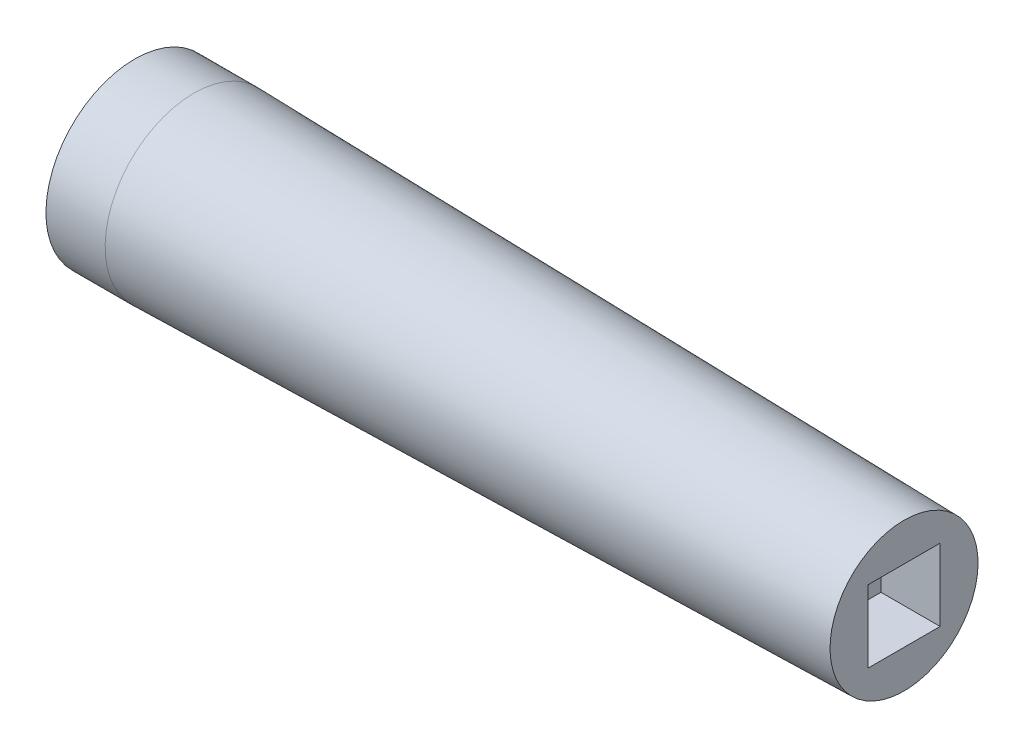
ISO-10303-21;
HEADER;
FILE_DESCRIPTION(('STEP AP214'),'2;1');
FILE_NAME('part.step','',(''),(''),'','','');
FILE_SCHEMA(('AUTOMOTIVE_DESIGN { 1 0 10303 214 1 1 1 1 }'));
ENDSEC;
DATA;
#1=APPLICATION_CONTEXT('core data for automotive mechanical design processes');
#2=APPLICATION_PROTOCOL_DEFINITION('international standard','automotive_design',2000,#1);
#3=PRODUCT_CONTEXT('',#1,'mechanical');
#4=PRODUCT('Part','Part','',(#3));
#5=PRODUCT_RELATED_PRODUCT_CATEGORY('part','',(#4));
#6=PRODUCT_DEFINITION_FORMATION('','',#4);
#7=PRODUCT_DEFINITION_CONTEXT('part definition',#1,'design');
#8=PRODUCT_DEFINITION('design','',#6,#7);
#9=PRODUCT_DEFINITION_SHAPE('','',#8);
#10=(LENGTH_UNIT() NAMED_UNIT(*) SI_UNIT(.MILLI.,.METRE.));
#11=(NAMED_UNIT(*) PLANE_ANGLE_UNIT() SI_UNIT($,.RADIAN.));
#12=(NAMED_UNIT(*) SI_UNIT($,.STERADIAN.) SOLID_ANGLE_UNIT());
#13=UNCERTAINTY_MEASURE_WITH_UNIT(LENGTH_MEASURE(1.E-05),#10,'distance_accuracy_value','');
#14=(GEOMETRIC_REPRESENTATION_CONTEXT(3) GLOBAL_UNCERTAINTY_ASSIGNED_CONTEXT((#13)) GLOBAL_UNIT_ASSIGNED_CONTEXT((#10,
#11,#12)) REPRESENTATION_CONTEXT('',''));
#15=CARTESIAN_POINT('',(0.,0.,0.));
#16=DIRECTION('',(0.,0.,1.));
#17=DIRECTION('',(1.,0.,0.));
#18=AXIS2_PLACEMENT_3D('',#15,#16,#17);
#19=CARTESIAN_POINT('',(82.55,0.,0.));
#20=DIRECTION('',(1.,0.,0.));
#21=DIRECTION('',(0.,1.,0.));
#22=AXIS2_PLACEMENT_3D('',#19,#20,#21);
#23=PLANE('',#22);
#24=DIRECTION('',(0.,1.,0.));
#25=VECTOR('',#24,1.);
#26=CARTESIAN_POINT('',(82.55,-7.74499999999998,-7.745));
#27=LINE('',#26,#25);
#28=CARTESIAN_POINT('',(82.55,-7.74499999999998,-7.745));
#29=VERTEX_POINT('',#28);
#30=CARTESIAN_POINT('',(82.55,7.74500000000003,-7.745));
#31=VERTEX_POINT('',#30);
#32=EDGE_CURVE('E51',#29,#31,#27,.T.);
#33=ORIENTED_EDGE('',*,*,#32,.F.);
#34=DIRECTION('',(0.,0.,-1.));
#35=VECTOR('',#34,1.);
#36=CARTESIAN_POINT('',(82.55,-7.74499999999998,7.745));
#37=LINE('',#36,#35);
#38=CARTESIAN_POINT('',(82.55,-7.74499999999998,7.745));
#39=VERTEX_POINT('',#38);
#40=EDGE_CURVE('E102',#39,#29,#37,.T.);
#41=ORIENTED_EDGE('',*,*,#40,.F.);
#42=DIRECTION('',(0.,-1.,0.));
#43=VECTOR('',#42,1.);
#44=CARTESIAN_POINT('',(82.55,-7.74499999999998,7.745));
#45=LINE('',#44,#43);
#46=CARTESIAN_POINT('',(82.55,7.74500000000003,7.745));
#47=VERTEX_POINT('',#46);
#48=EDGE_CURVE('E108',#47,#39,#45,.T.);
#49=ORIENTED_EDGE('',*,*,#48,.F.);
#50=DIRECTION('',(0.,0.,1.));
#51=VECTOR('',#50,1.);
#52=CARTESIAN_POINT('',(82.55,7.74500000000003,7.745));
#53=LINE('',#52,#51);
#54=EDGE_CURVE('E86',#31,#47,#53,.T.);
#55=ORIENTED_EDGE('',*,*,#54,.F.);
#56=EDGE_LOOP('',(#33,#41,#49,#55));
#57=FACE_BOUND('',#56,.T.);
#58=CARTESIAN_POINT('',(82.55,0.,0.));
#59=DIRECTION('',(1.,0.,0.));
#60=DIRECTION('',(0.,1.,0.));
#61=AXIS2_PLACEMENT_3D('',#58,#59,#60);
#62=CIRCLE('',#61,15.88);
#63=CARTESIAN_POINT('',(82.55,15.88,0.));
#64=VERTEX_POINT('',#63);
#65=EDGE_CURVE('E112',#64,#64,#62,.T.);
#66=ORIENTED_EDGE('',*,*,#65,.T.);
#67=EDGE_LOOP('',(#66));
#68=FACE_BOUND('',#67,.T.);
#69=ADVANCED_FACE('F37',(#57,#68),#23,.T.);
#70=CARTESIAN_POINT('',(-82.55,0.,0.));
#71=DIRECTION('',(-1.,0.,0.));
#72=DIRECTION('',(0.,-1.,0.));
#73=AXIS2_PLACEMENT_3D('',#70,#71,#72);
#74=PLANE('',#73);
#75=CARTESIAN_POINT('',(-82.55,0.,0.));
#76=DIRECTION('',(1.,0.,0.));
#77=DIRECTION('',(0.,1.,0.));
#78=AXIS2_PLACEMENT_3D('',#75,#76,#77);
#79=CIRCLE('',#78,19.05);
#80=CARTESIAN_POINT('',(-82.55,19.05,0.));
#81=VERTEX_POINT('',#80);
#82=EDGE_CURVE('E11',#81,#81,#79,.T.);
#83=ORIENTED_EDGE('',*,*,#82,.F.);
#84=EDGE_LOOP('',(#83));
#85=FACE_BOUND('',#84,.T.);
#86=ADVANCED_FACE('F124',(#85),#74,.T.);
#87=CARTESIAN_POINT('',(82.55,0.,0.));
#88=DIRECTION('',(1.,0.,0.));
#89=DIRECTION('',(0.,1.,0.));
#90=AXIS2_PLACEMENT_3D('',#87,#88,#89);
#91=CYLINDRICAL_SURFACE('',#90,19.05);
#92=ORIENTED_EDGE('',*,*,#82,.T.);
#93=EDGE_LOOP('',(#92));
#94=FACE_BOUND('',#93,.T.);
#95=CARTESIAN_POINT('',(-69.85,0.,0.));
#96=DIRECTION('',(1.,0.,0.));
#97=DIRECTION('',(0.,1.,0.));
#98=AXIS2_PLACEMENT_3D('',#95,#96,#97);
#99=CIRCLE('',#98,19.05);
#100=CARTESIAN_POINT('',(-69.85,19.05,0.));
#101=VERTEX_POINT('',#100);
#102=EDGE_CURVE('E44',#101,#101,#99,.T.);
#103=ORIENTED_EDGE('',*,*,#102,.F.);
#104=EDGE_LOOP('',(#103));
#105=FACE_BOUND('',#104,.T.);
#106=ADVANCED_FACE('F122',(#94,#105),#91,.T.);
#107=CARTESIAN_POINT('',(82.55,0.,0.));
#108=DIRECTION('',(-1.,0.,0.));
#109=DIRECTION('',(0.,-1.,0.));
#110=AXIS2_PLACEMENT_3D('',#107,#108,#109);
#111=CONICAL_SURFACE('',#110,15.88,0.020797525848452);
#112=ORIENTED_EDGE('',*,*,#102,.T.);
#113=EDGE_LOOP('',(#112));
#114=FACE_BOUND('',#113,.T.);
#115=ORIENTED_EDGE('',*,*,#65,.F.);
#116=EDGE_LOOP('',(#115));
#117=FACE_BOUND('',#116,.T.);
#118=ADVANCED_FACE('F119',(#114,#117),#111,.T.);
#119=CARTESIAN_POINT('',(69.85,-7.74499999999998,-7.745));
#120=DIRECTION('',(0.,0.,-1.));
#121=DIRECTION('',(-1.,0.,0.));
#122=AXIS2_PLACEMENT_3D('',#119,#120,#121);
#123=PLANE('',#122);
#124=ORIENTED_EDGE('',*,*,#32,.T.);
#125=DIRECTION('',(1.,0.,0.));
#126=VECTOR('',#125,1.);
#127=CARTESIAN_POINT('',(69.85,7.74500000000002,-7.745));
#128=LINE('',#127,#126);
#129=CARTESIAN_POINT('',(69.85,7.74500000000002,-7.745));
#130=VERTEX_POINT('',#129);
#131=EDGE_CURVE('E74',#130,#31,#128,.T.);
#132=ORIENTED_EDGE('',*,*,#131,.F.);
#133=DIRECTION('',(0.,1.,0.));
#134=VECTOR('',#133,1.);
#135=CARTESIAN_POINT('',(69.85,-7.74499999999998,-7.745));
#136=LINE('',#135,#134);
#137=CARTESIAN_POINT('',(69.85,-7.74499999999998,-7.745));
#138=VERTEX_POINT('',#137);
#139=EDGE_CURVE('E100',#138,#130,#136,.T.);
#140=ORIENTED_EDGE('',*,*,#139,.F.);
#141=DIRECTION('',(1.,0.,0.));
#142=VECTOR('',#141,1.);
#143=CARTESIAN_POINT('',(69.85,-7.74499999999998,-7.745));
#144=LINE('',#143,#142);
#145=EDGE_CURVE('E59',#138,#29,#144,.T.);
#146=ORIENTED_EDGE('',*,*,#145,.T.);
#147=EDGE_LOOP('',(#124,#132,#140,#146));
#148=FACE_BOUND('',#147,.T.);
#149=ADVANCED_FACE('F131',(#148),#123,.F.);
#150=CARTESIAN_POINT('',(69.85,-7.74499999999998,7.745));
#151=DIRECTION('',(0.,-1.,0.));
#152=DIRECTION('',(1.,0.,0.));
#153=AXIS2_PLACEMENT_3D('',#150,#151,#152);
#154=PLANE('',#153);
#155=ORIENTED_EDGE('',*,*,#40,.T.);
#156=ORIENTED_EDGE('',*,*,#145,.F.);
#157=DIRECTION('',(0.,0.,-1.));
#158=VECTOR('',#157,1.);
#159=CARTESIAN_POINT('',(69.85,-7.74499999999998,7.745));
#160=LINE('',#159,#158);
#161=CARTESIAN_POINT('',(69.85,-7.74499999999998,7.745));
#162=VERTEX_POINT('',#161);
#163=EDGE_CURVE('E97',#162,#138,#160,.T.);
#164=ORIENTED_EDGE('',*,*,#163,.F.);
#165=DIRECTION('',(1.,0.,0.));
#166=VECTOR('',#165,1.);
#167=CARTESIAN_POINT('',(69.85,-7.74499999999998,7.745));
#168=LINE('',#167,#166);
#169=EDGE_CURVE('E90',#162,#39,#168,.T.);
#170=ORIENTED_EDGE('',*,*,#169,.T.);
#171=EDGE_LOOP('',(#155,#156,#164,#170));
#172=FACE_BOUND('',#171,.T.);
#173=ADVANCED_FACE('F141',(#172),#154,.F.);
#174=CARTESIAN_POINT('',(69.85,-7.74499999999998,7.745));
#175=DIRECTION('',(0.,0.,1.));
#176=DIRECTION('',(1.,0.,0.));
#177=AXIS2_PLACEMENT_3D('',#174,#175,#176);
#178=PLANE('',#177);
#179=ORIENTED_EDGE('',*,*,#48,.T.);
#180=ORIENTED_EDGE('',*,*,#169,.F.);
#181=DIRECTION('',(0.,-1.,0.));
#182=VECTOR('',#181,1.);
#183=CARTESIAN_POINT('',(69.85,-7.74499999999998,7.745));
#184=LINE('',#183,#182);
#185=CARTESIAN_POINT('',(69.85,7.74500000000002,7.745));
#186=VERTEX_POINT('',#185);
#187=EDGE_CURVE('E93',#186,#162,#184,.T.);
#188=ORIENTED_EDGE('',*,*,#187,.F.);
#189=DIRECTION('',(1.,0.,0.));
#190=VECTOR('',#189,1.);
#191=CARTESIAN_POINT('',(69.85,7.74500000000002,7.745));
#192=LINE('',#191,#190);
#193=EDGE_CURVE('E79',#186,#47,#192,.T.);
#194=ORIENTED_EDGE('',*,*,#193,.T.);
#195=EDGE_LOOP('',(#179,#180,#188,#194));
#196=FACE_BOUND('',#195,.T.);
#197=ADVANCED_FACE('F94',(#196),#178,.F.);
#198=CARTESIAN_POINT('',(69.85,7.74500000000002,7.745));
#199=DIRECTION('',(0.,1.,0.));
#200=DIRECTION('',(-1.,0.,0.));
#201=AXIS2_PLACEMENT_3D('',#198,#199,#200);
#202=PLANE('',#201);
#203=ORIENTED_EDGE('',*,*,#54,.T.);
#204=ORIENTED_EDGE('',*,*,#193,.F.);
#205=DIRECTION('',(0.,0.,1.));
#206=VECTOR('',#205,1.);
#207=CARTESIAN_POINT('',(69.85,7.74500000000002,7.745));
#208=LINE('',#207,#206);
#209=EDGE_CURVE('E83',#130,#186,#208,.T.);
#210=ORIENTED_EDGE('',*,*,#209,.F.);
#211=ORIENTED_EDGE('',*,*,#131,.T.);
#212=EDGE_LOOP('',(#203,#204,#210,#211));
#213=FACE_BOUND('',#212,.T.);
#214=ADVANCED_FACE('F81',(#213),#202,.F.);
#215=CARTESIAN_POINT('',(69.85,0.,0.));
#216=DIRECTION('',(-1.,0.,0.));
#217=DIRECTION('',(0.,0.,1.));
#218=AXIS2_PLACEMENT_3D('',#215,#216,#217);
#219=PLANE('',#218);
#220=ORIENTED_EDGE('',*,*,#139,.T.);
#221=ORIENTED_EDGE('',*,*,#209,.T.);
#222=ORIENTED_EDGE('',*,*,#187,.T.);
#223=ORIENTED_EDGE('',*,*,#163,.T.);
#224=EDGE_LOOP('',(#220,#221,#222,#223));
#225=FACE_BOUND('',#224,.T.);
#226=ADVANCED_FACE('F99',(#225),#219,.F.);
#227=CLOSED_SHELL('',(#69,#86,#106,#118,#149,#173,#197,#214,#226));
#228=MANIFOLD_SOLID_BREP('B2',#227);
#229=ADVANCED_BREP_SHAPE_REPRESENTATION('',(#18,#228),#14);
#230=SHAPE_DEFINITION_REPRESENTATION(#9,#229);
ENDSEC;
END-ISO-10303-21;
